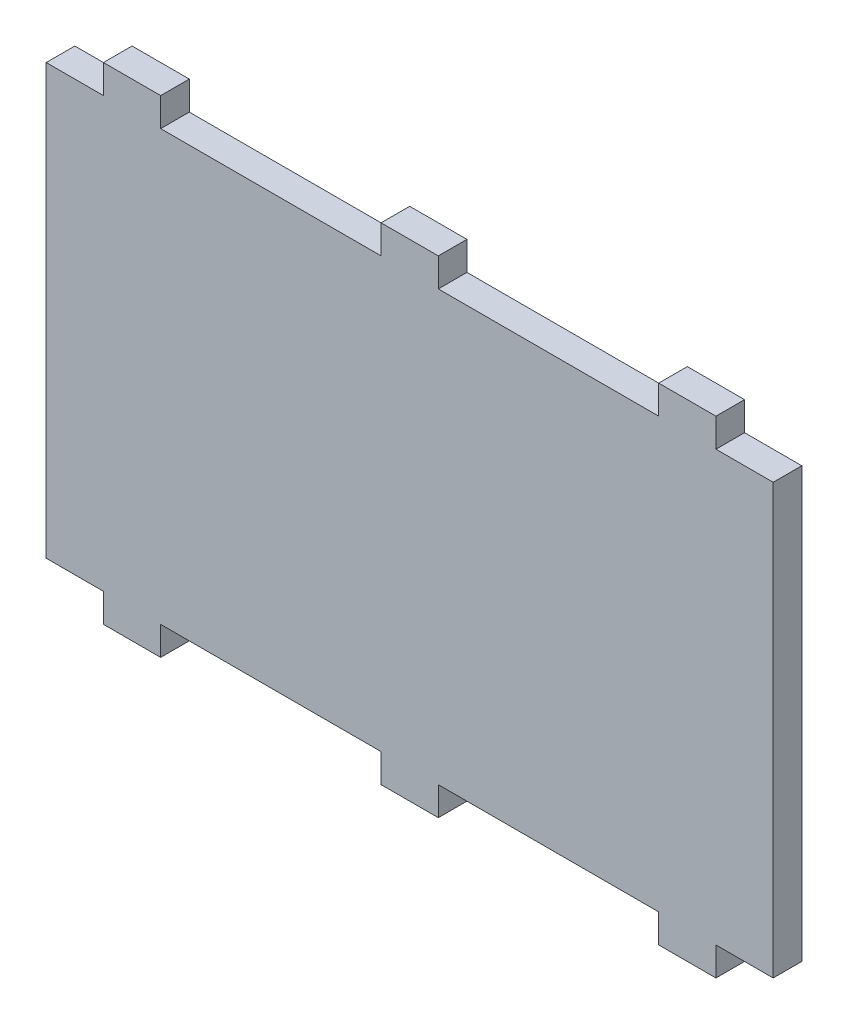
ISO-10303-21;
HEADER;
FILE_DESCRIPTION(('STEP AP214'),'2;1');
FILE_NAME('part.step','',(''),(''),'','','');
FILE_SCHEMA(('AUTOMOTIVE_DESIGN { 1 0 10303 214 1 1 1 1 }'));
ENDSEC;
DATA;
#1=APPLICATION_CONTEXT('core data for automotive mechanical design processes');
#2=APPLICATION_PROTOCOL_DEFINITION('international standard','automotive_design',2000,#1);
#3=PRODUCT_CONTEXT('',#1,'mechanical');
#4=PRODUCT('Part','Part','',(#3));
#5=PRODUCT_RELATED_PRODUCT_CATEGORY('part','',(#4));
#6=PRODUCT_DEFINITION_FORMATION('','',#4);
#7=PRODUCT_DEFINITION_CONTEXT('part definition',#1,'design');
#8=PRODUCT_DEFINITION('design','',#6,#7);
#9=PRODUCT_DEFINITION_SHAPE('','',#8);
#10=(LENGTH_UNIT() NAMED_UNIT(*) SI_UNIT(.MILLI.,.METRE.));
#11=(NAMED_UNIT(*) PLANE_ANGLE_UNIT() SI_UNIT($,.RADIAN.));
#12=(NAMED_UNIT(*) SI_UNIT($,.STERADIAN.) SOLID_ANGLE_UNIT());
#13=UNCERTAINTY_MEASURE_WITH_UNIT(LENGTH_MEASURE(1.E-05),#10,'distance_accuracy_value','');
#14=(GEOMETRIC_REPRESENTATION_CONTEXT(3) GLOBAL_UNCERTAINTY_ASSIGNED_CONTEXT((#13)) GLOBAL_UNIT_ASSIGNED_CONTEXT((#10,
#11,#12)) REPRESENTATION_CONTEXT('',''));
#15=CARTESIAN_POINT('',(0.,0.,0.));
#16=DIRECTION('',(0.,0.,1.));
#17=DIRECTION('',(1.,0.,0.));
#18=AXIS2_PLACEMENT_3D('',#15,#16,#17);
#19=CARTESIAN_POINT('',(0.,0.,5.));
#20=DIRECTION('',(0.,1.,0.));
#21=DIRECTION('',(0.,0.,1.));
#22=AXIS2_PLACEMENT_3D('',#19,#20,#21);
#23=PLANE('',#22);
#24=DIRECTION('',(1.,0.,0.));
#25=VECTOR('',#24,1.);
#26=CARTESIAN_POINT('',(0.,0.,0.));
#27=LINE('',#26,#25);
#28=CARTESIAN_POINT('',(68.5,0.,0.));
#29=VERTEX_POINT('',#28);
#30=CARTESIAN_POINT('',(107.,0.,0.));
#31=VERTEX_POINT('',#30);
#32=EDGE_CURVE('E320',#29,#31,#27,.T.);
#33=ORIENTED_EDGE('',*,*,#32,.T.);
#34=DIRECTION('',(0.,0.,1.));
#35=VECTOR('',#34,1.);
#36=CARTESIAN_POINT('',(107.,0.,0.));
#37=LINE('',#36,#35);
#38=CARTESIAN_POINT('',(107.,0.,5.));
#39=VERTEX_POINT('',#38);
#40=EDGE_CURVE('E58',#31,#39,#37,.T.);
#41=ORIENTED_EDGE('',*,*,#40,.T.);
#42=DIRECTION('',(1.,0.,0.));
#43=VECTOR('',#42,1.);
#44=CARTESIAN_POINT('',(0.,0.,5.));
#45=LINE('',#44,#43);
#46=CARTESIAN_POINT('',(68.5,0.,5.));
#47=VERTEX_POINT('',#46);
#48=EDGE_CURVE('E325',#47,#39,#45,.T.);
#49=ORIENTED_EDGE('',*,*,#48,.F.);
#50=DIRECTION('',(0.,0.,1.));
#51=VECTOR('',#50,1.);
#52=CARTESIAN_POINT('',(68.5,0.,0.));
#53=LINE('',#52,#51);
#54=EDGE_CURVE('E278',#29,#47,#53,.T.);
#55=ORIENTED_EDGE('',*,*,#54,.F.);
#56=EDGE_LOOP('',(#33,#41,#49,#55));
#57=FACE_BOUND('',#56,.T.);
#58=ADVANCED_FACE('F33',(#57),#23,.F.);
#59=CARTESIAN_POINT('',(20.,0.,0.));
#60=VERTEX_POINT('',#59);
#61=CARTESIAN_POINT('',(58.5,0.,0.));
#62=VERTEX_POINT('',#61);
#63=EDGE_CURVE('E323',#60,#62,#27,.T.);
#64=ORIENTED_EDGE('',*,*,#63,.T.);
#65=DIRECTION('',(0.,0.,1.));
#66=VECTOR('',#65,1.);
#67=CARTESIAN_POINT('',(58.5,0.,0.));
#68=LINE('',#67,#66);
#69=CARTESIAN_POINT('',(58.5,0.,5.));
#70=VERTEX_POINT('',#69);
#71=EDGE_CURVE('E275',#62,#70,#68,.T.);
#72=ORIENTED_EDGE('',*,*,#71,.T.);
#73=CARTESIAN_POINT('',(20.,0.,5.));
#74=VERTEX_POINT('',#73);
#75=EDGE_CURVE('E737',#74,#70,#45,.T.);
#76=ORIENTED_EDGE('',*,*,#75,.F.);
#77=DIRECTION('',(0.,0.,1.));
#78=VECTOR('',#77,1.);
#79=CARTESIAN_POINT('',(20.,0.,0.));
#80=LINE('',#79,#78);
#81=EDGE_CURVE('E303',#60,#74,#80,.T.);
#82=ORIENTED_EDGE('',*,*,#81,.F.);
#83=EDGE_LOOP('',(#64,#72,#76,#82));
#84=FACE_BOUND('',#83,.T.);
#85=ADVANCED_FACE('F496',(#84),#23,.F.);
#86=CARTESIAN_POINT('',(117.,0.,5.));
#87=VERTEX_POINT('',#86);
#88=CARTESIAN_POINT('',(127.,0.,5.));
#89=VERTEX_POINT('',#88);
#90=EDGE_CURVE('E37',#87,#89,#45,.T.);
#91=ORIENTED_EDGE('',*,*,#90,.F.);
#92=DIRECTION('',(0.,0.,1.));
#93=VECTOR('',#92,1.);
#94=CARTESIAN_POINT('',(117.,0.,0.));
#95=LINE('',#94,#93);
#96=CARTESIAN_POINT('',(117.,0.,0.));
#97=VERTEX_POINT('',#96);
#98=EDGE_CURVE('E254',#97,#87,#95,.T.);
#99=ORIENTED_EDGE('',*,*,#98,.F.);
#100=CARTESIAN_POINT('',(127.,0.,0.));
#101=VERTEX_POINT('',#100);
#102=EDGE_CURVE('E324',#97,#101,#27,.T.);
#103=ORIENTED_EDGE('',*,*,#102,.T.);
#104=DIRECTION('',(0.,0.,-1.));
#105=VECTOR('',#104,1.);
#106=CARTESIAN_POINT('',(127.,0.,5.));
#107=LINE('',#106,#105);
#108=EDGE_CURVE('E43',#89,#101,#107,.T.);
#109=ORIENTED_EDGE('',*,*,#108,.F.);
#110=EDGE_LOOP('',(#91,#99,#103,#109));
#111=FACE_BOUND('',#110,.T.);
#112=ADVANCED_FACE('F491',(#111),#23,.F.);
#113=CARTESIAN_POINT('',(0.,75.,5.));
#114=DIRECTION('',(0.,-1.,0.));
#115=DIRECTION('',(0.,0.,-1.));
#116=AXIS2_PLACEMENT_3D('',#113,#114,#115);
#117=PLANE('',#116);
#118=DIRECTION('',(-1.,0.,0.));
#119=VECTOR('',#118,1.);
#120=CARTESIAN_POINT('',(0.,75.,5.));
#121=LINE('',#120,#119);
#122=CARTESIAN_POINT('',(58.5,75.,5.));
#123=VERTEX_POINT('',#122);
#124=CARTESIAN_POINT('',(20.,75.,5.));
#125=VERTEX_POINT('',#124);
#126=EDGE_CURVE('E342',#123,#125,#121,.T.);
#127=ORIENTED_EDGE('',*,*,#126,.F.);
#128=DIRECTION('',(0.,0.,1.));
#129=VECTOR('',#128,1.);
#130=CARTESIAN_POINT('',(58.5,75.,0.));
#131=LINE('',#130,#129);
#132=CARTESIAN_POINT('',(58.5,75.,0.));
#133=VERTEX_POINT('',#132);
#134=EDGE_CURVE('E766',#133,#123,#131,.T.);
#135=ORIENTED_EDGE('',*,*,#134,.F.);
#136=DIRECTION('',(-1.,0.,0.));
#137=VECTOR('',#136,1.);
#138=CARTESIAN_POINT('',(0.,75.,0.));
#139=LINE('',#138,#137);
#140=CARTESIAN_POINT('',(20.,75.,0.));
#141=VERTEX_POINT('',#140);
#142=EDGE_CURVE('E346',#133,#141,#139,.T.);
#143=ORIENTED_EDGE('',*,*,#142,.T.);
#144=DIRECTION('',(0.,0.,1.));
#145=VECTOR('',#144,1.);
#146=CARTESIAN_POINT('',(20.,75.,0.));
#147=LINE('',#146,#145);
#148=EDGE_CURVE('E442',#141,#125,#147,.T.);
#149=ORIENTED_EDGE('',*,*,#148,.T.);
#150=EDGE_LOOP('',(#127,#135,#143,#149));
#151=FACE_BOUND('',#150,.T.);
#152=ADVANCED_FACE('F484',(#151),#117,.F.);
#153=CARTESIAN_POINT('',(127.,75.,0.));
#154=VERTEX_POINT('',#153);
#155=CARTESIAN_POINT('',(117.,75.,0.));
#156=VERTEX_POINT('',#155);
#157=EDGE_CURVE('E363',#154,#156,#139,.T.);
#158=ORIENTED_EDGE('',*,*,#157,.T.);
#159=DIRECTION('',(0.,0.,1.));
#160=VECTOR('',#159,1.);
#161=CARTESIAN_POINT('',(117.,75.,0.));
#162=LINE('',#161,#160);
#163=CARTESIAN_POINT('',(117.,75.,5.));
#164=VERTEX_POINT('',#163);
#165=EDGE_CURVE('E402',#156,#164,#162,.T.);
#166=ORIENTED_EDGE('',*,*,#165,.T.);
#167=CARTESIAN_POINT('',(127.,75.,5.));
#168=VERTEX_POINT('',#167);
#169=EDGE_CURVE('E357',#168,#164,#121,.T.);
#170=ORIENTED_EDGE('',*,*,#169,.F.);
#171=DIRECTION('',(0.,0.,-1.));
#172=VECTOR('',#171,1.);
#173=CARTESIAN_POINT('',(127.,75.,5.));
#174=LINE('',#173,#172);
#175=EDGE_CURVE('E378',#168,#154,#174,.T.);
#176=ORIENTED_EDGE('',*,*,#175,.T.);
#177=EDGE_LOOP('',(#158,#166,#170,#176));
#178=FACE_BOUND('',#177,.T.);
#179=ADVANCED_FACE('F482',(#178),#117,.F.);
#180=DIRECTION('',(0.,0.,1.));
#181=VECTOR('',#180,1.);
#182=CARTESIAN_POINT('',(9.99999999999999,75.,0.));
#183=LINE('',#182,#181);
#184=CARTESIAN_POINT('',(9.99999999999999,75.,0.));
#185=VERTEX_POINT('',#184);
#186=CARTESIAN_POINT('',(9.99999999999999,75.,5.));
#187=VERTEX_POINT('',#186);
#188=EDGE_CURVE('E431',#185,#187,#183,.T.);
#189=ORIENTED_EDGE('',*,*,#188,.F.);
#190=CARTESIAN_POINT('',(0.,75.,0.));
#191=VERTEX_POINT('',#190);
#192=EDGE_CURVE('E372',#185,#191,#139,.T.);
#193=ORIENTED_EDGE('',*,*,#192,.T.);
#194=DIRECTION('',(0.,0.,-1.));
#195=VECTOR('',#194,1.);
#196=CARTESIAN_POINT('',(0.,75.,5.));
#197=LINE('',#196,#195);
#198=CARTESIAN_POINT('',(0.,75.,5.));
#199=VERTEX_POINT('',#198);
#200=EDGE_CURVE('E368',#199,#191,#197,.T.);
#201=ORIENTED_EDGE('',*,*,#200,.F.);
#202=EDGE_CURVE('E345',#187,#199,#121,.T.);
#203=ORIENTED_EDGE('',*,*,#202,.F.);
#204=EDGE_LOOP('',(#189,#193,#201,#203));
#205=FACE_BOUND('',#204,.T.);
#206=ADVANCED_FACE('F477',(#205),#117,.F.);
#207=CARTESIAN_POINT('',(0.,0.,5.));
#208=DIRECTION('',(1.,0.,0.));
#209=DIRECTION('',(0.,0.,-1.));
#210=AXIS2_PLACEMENT_3D('',#207,#208,#209);
#211=PLANE('',#210);
#212=DIRECTION('',(0.,-1.,0.));
#213=VECTOR('',#212,1.);
#214=CARTESIAN_POINT('',(0.,0.,0.));
#215=LINE('',#214,#213);
#216=CARTESIAN_POINT('',(0.,0.,0.));
#217=VERTEX_POINT('',#216);
#218=EDGE_CURVE('E329',#191,#217,#215,.T.);
#219=ORIENTED_EDGE('',*,*,#218,.T.);
#220=DIRECTION('',(0.,0.,-1.));
#221=VECTOR('',#220,1.);
#222=CARTESIAN_POINT('',(0.,0.,5.));
#223=LINE('',#222,#221);
#224=CARTESIAN_POINT('',(0.,0.,5.));
#225=VERTEX_POINT('',#224);
#226=EDGE_CURVE('E11',#225,#217,#223,.T.);
#227=ORIENTED_EDGE('',*,*,#226,.F.);
#228=DIRECTION('',(0.,-1.,0.));
#229=VECTOR('',#228,1.);
#230=CARTESIAN_POINT('',(0.,0.,5.));
#231=LINE('',#230,#229);
#232=EDGE_CURVE('E375',#199,#225,#231,.T.);
#233=ORIENTED_EDGE('',*,*,#232,.F.);
#234=ORIENTED_EDGE('',*,*,#200,.T.);
#235=EDGE_LOOP('',(#219,#227,#233,#234));
#236=FACE_BOUND('',#235,.T.);
#237=ADVANCED_FACE('F35',(#236),#211,.F.);
#238=CARTESIAN_POINT('',(10.,0.,0.));
#239=VERTEX_POINT('',#238);
#240=EDGE_CURVE('E339',#217,#239,#27,.T.);
#241=ORIENTED_EDGE('',*,*,#240,.T.);
#242=DIRECTION('',(0.,0.,1.));
#243=VECTOR('',#242,1.);
#244=CARTESIAN_POINT('',(10.,0.,0.));
#245=LINE('',#244,#243);
#246=CARTESIAN_POINT('',(10.,0.,5.));
#247=VERTEX_POINT('',#246);
#248=EDGE_CURVE('E298',#239,#247,#245,.T.);
#249=ORIENTED_EDGE('',*,*,#248,.T.);
#250=EDGE_CURVE('E739',#225,#247,#45,.T.);
#251=ORIENTED_EDGE('',*,*,#250,.F.);
#252=ORIENTED_EDGE('',*,*,#226,.T.);
#253=EDGE_LOOP('',(#241,#249,#251,#252));
#254=FACE_BOUND('',#253,.T.);
#255=ADVANCED_FACE('F497',(#254),#23,.F.);
#256=CARTESIAN_POINT('',(127.,0.,5.));
#257=DIRECTION('',(-1.,0.,0.));
#258=DIRECTION('',(0.,0.,1.));
#259=AXIS2_PLACEMENT_3D('',#256,#257,#258);
#260=PLANE('',#259);
#261=DIRECTION('',(0.,1.,0.));
#262=VECTOR('',#261,1.);
#263=CARTESIAN_POINT('',(127.,0.,0.));
#264=LINE('',#263,#262);
#265=EDGE_CURVE('E331',#101,#154,#264,.T.);
#266=ORIENTED_EDGE('',*,*,#265,.T.);
#267=ORIENTED_EDGE('',*,*,#175,.F.);
#268=DIRECTION('',(0.,1.,0.));
#269=VECTOR('',#268,1.);
#270=CARTESIAN_POINT('',(127.,0.,5.));
#271=LINE('',#270,#269);
#272=EDGE_CURVE('E350',#89,#168,#271,.T.);
#273=ORIENTED_EDGE('',*,*,#272,.F.);
#274=ORIENTED_EDGE('',*,*,#108,.T.);
#275=EDGE_LOOP('',(#266,#267,#273,#274));
#276=FACE_BOUND('',#275,.T.);
#277=ADVANCED_FACE('F480',(#276),#260,.F.);
#278=CARTESIAN_POINT('',(107.,75.,0.));
#279=VERTEX_POINT('',#278);
#280=CARTESIAN_POINT('',(68.5,75.,0.));
#281=VERTEX_POINT('',#280);
#282=EDGE_CURVE('E361',#279,#281,#139,.T.);
#283=ORIENTED_EDGE('',*,*,#282,.T.);
#284=DIRECTION('',(0.,0.,1.));
#285=VECTOR('',#284,1.);
#286=CARTESIAN_POINT('',(68.5,75.,0.));
#287=LINE('',#286,#285);
#288=CARTESIAN_POINT('',(68.5,75.,5.));
#289=VERTEX_POINT('',#288);
#290=EDGE_CURVE('E774',#281,#289,#287,.T.);
#291=ORIENTED_EDGE('',*,*,#290,.T.);
#292=CARTESIAN_POINT('',(107.,75.,5.));
#293=VERTEX_POINT('',#292);
#294=EDGE_CURVE('E344',#293,#289,#121,.T.);
#295=ORIENTED_EDGE('',*,*,#294,.F.);
#296=DIRECTION('',(0.,0.,1.));
#297=VECTOR('',#296,1.);
#298=CARTESIAN_POINT('',(107.,75.,0.));
#299=LINE('',#298,#297);
#300=EDGE_CURVE('E422',#279,#293,#299,.T.);
#301=ORIENTED_EDGE('',*,*,#300,.F.);
#302=EDGE_LOOP('',(#283,#291,#295,#301));
#303=FACE_BOUND('',#302,.T.);
#304=ADVANCED_FACE('F490',(#303),#117,.F.);
#305=CARTESIAN_POINT('',(0.,0.,5.));
#306=DIRECTION('',(0.,0.,-1.));
#307=DIRECTION('',(-1.,0.,0.));
#308=AXIS2_PLACEMENT_3D('',#305,#306,#307);
#309=PLANE('',#308);
#310=ORIENTED_EDGE('',*,*,#232,.T.);
#311=ORIENTED_EDGE('',*,*,#250,.T.);
#312=DIRECTION('',(0.,-1.,0.));
#313=VECTOR('',#312,1.);
#314=CARTESIAN_POINT('',(10.,0.,5.));
#315=LINE('',#314,#313);
#316=CARTESIAN_POINT('',(10.,-5.,5.));
#317=VERTEX_POINT('',#316);
#318=EDGE_CURVE('E277',#247,#317,#315,.T.);
#319=ORIENTED_EDGE('',*,*,#318,.T.);
#320=DIRECTION('',(1.,0.,0.));
#321=VECTOR('',#320,1.);
#322=CARTESIAN_POINT('',(10.,-5.,5.));
#323=LINE('',#322,#321);
#324=CARTESIAN_POINT('',(20.,-5.,5.));
#325=VERTEX_POINT('',#324);
#326=EDGE_CURVE('E289',#317,#325,#323,.T.);
#327=ORIENTED_EDGE('',*,*,#326,.T.);
#328=DIRECTION('',(0.,1.,0.));
#329=VECTOR('',#328,1.);
#330=CARTESIAN_POINT('',(20.,0.,5.));
#331=LINE('',#330,#329);
#332=EDGE_CURVE('E292',#325,#74,#331,.T.);
#333=ORIENTED_EDGE('',*,*,#332,.T.);
#334=ORIENTED_EDGE('',*,*,#75,.T.);
#335=DIRECTION('',(0.,-1.,0.));
#336=VECTOR('',#335,1.);
#337=CARTESIAN_POINT('',(58.5,0.,5.));
#338=LINE('',#337,#336);
#339=CARTESIAN_POINT('',(58.5,-5.,5.));
#340=VERTEX_POINT('',#339);
#341=EDGE_CURVE('E253',#70,#340,#338,.T.);
#342=ORIENTED_EDGE('',*,*,#341,.T.);
#343=DIRECTION('',(1.,0.,0.));
#344=VECTOR('',#343,1.);
#345=CARTESIAN_POINT('',(58.5,-5.,5.));
#346=LINE('',#345,#344);
#347=CARTESIAN_POINT('',(68.5,-5.,5.));
#348=VERTEX_POINT('',#347);
#349=EDGE_CURVE('E270',#340,#348,#346,.T.);
#350=ORIENTED_EDGE('',*,*,#349,.T.);
#351=DIRECTION('',(0.,1.,0.));
#352=VECTOR('',#351,1.);
#353=CARTESIAN_POINT('',(68.5,0.,5.));
#354=LINE('',#353,#352);
#355=EDGE_CURVE('E261',#348,#47,#354,.T.);
#356=ORIENTED_EDGE('',*,*,#355,.T.);
#357=ORIENTED_EDGE('',*,*,#48,.T.);
#358=DIRECTION('',(0.,-1.,0.));
#359=VECTOR('',#358,1.);
#360=CARTESIAN_POINT('',(107.,0.,5.));
#361=LINE('',#360,#359);
#362=CARTESIAN_POINT('',(107.,-5.,5.));
#363=VERTEX_POINT('',#362);
#364=EDGE_CURVE('E249',#39,#363,#361,.T.);
#365=ORIENTED_EDGE('',*,*,#364,.T.);
#366=DIRECTION('',(1.,0.,0.));
#367=VECTOR('',#366,1.);
#368=CARTESIAN_POINT('',(107.,-5.,5.));
#369=LINE('',#368,#367);
#370=CARTESIAN_POINT('',(117.,-5.,5.));
#371=VERTEX_POINT('',#370);
#372=EDGE_CURVE('E226',#363,#371,#369,.T.);
#373=ORIENTED_EDGE('',*,*,#372,.T.);
#374=DIRECTION('',(0.,1.,0.));
#375=VECTOR('',#374,1.);
#376=CARTESIAN_POINT('',(117.,0.,5.));
#377=LINE('',#376,#375);
#378=EDGE_CURVE('E243',#371,#87,#377,.T.);
#379=ORIENTED_EDGE('',*,*,#378,.T.);
#380=ORIENTED_EDGE('',*,*,#90,.T.);
#381=ORIENTED_EDGE('',*,*,#272,.T.);
#382=ORIENTED_EDGE('',*,*,#169,.T.);
#383=DIRECTION('',(0.,1.,0.));
#384=VECTOR('',#383,1.);
#385=CARTESIAN_POINT('',(117.,75.,5.));
#386=LINE('',#385,#384);
#387=CARTESIAN_POINT('',(117.,80.,5.));
#388=VERTEX_POINT('',#387);
#389=EDGE_CURVE('E396',#164,#388,#386,.T.);
#390=ORIENTED_EDGE('',*,*,#389,.T.);
#391=DIRECTION('',(-1.,0.,0.));
#392=VECTOR('',#391,1.);
#393=CARTESIAN_POINT('',(117.,80.,5.));
#394=LINE('',#393,#392);
#395=CARTESIAN_POINT('',(107.,80.,5.));
#396=VERTEX_POINT('',#395);
#397=EDGE_CURVE('E406',#388,#396,#394,.T.);
#398=ORIENTED_EDGE('',*,*,#397,.T.);
#399=DIRECTION('',(0.,-1.,0.));
#400=VECTOR('',#399,1.);
#401=CARTESIAN_POINT('',(107.,75.,5.));
#402=LINE('',#401,#400);
#403=EDGE_CURVE('E409',#396,#293,#402,.T.);
#404=ORIENTED_EDGE('',*,*,#403,.T.);
#405=ORIENTED_EDGE('',*,*,#294,.T.);
#406=DIRECTION('',(0.,1.,0.));
#407=VECTOR('',#406,1.);
#408=CARTESIAN_POINT('',(68.5,75.,5.));
#409=LINE('',#408,#407);
#410=CARTESIAN_POINT('',(68.5,80.,5.));
#411=VERTEX_POINT('',#410);
#412=EDGE_CURVE('E768',#289,#411,#409,.T.);
#413=ORIENTED_EDGE('',*,*,#412,.T.);
#414=DIRECTION('',(-1.,0.,0.));
#415=VECTOR('',#414,1.);
#416=CARTESIAN_POINT('',(58.5,80.,5.));
#417=LINE('',#416,#415);
#418=CARTESIAN_POINT('',(58.5,80.,5.));
#419=VERTEX_POINT('',#418);
#420=EDGE_CURVE('E760',#411,#419,#417,.T.);
#421=ORIENTED_EDGE('',*,*,#420,.T.);
#422=DIRECTION('',(0.,-1.,0.));
#423=VECTOR('',#422,1.);
#424=CARTESIAN_POINT('',(58.5,75.,5.));
#425=LINE('',#424,#423);
#426=EDGE_CURVE('E302',#419,#123,#425,.T.);
#427=ORIENTED_EDGE('',*,*,#426,.T.);
#428=ORIENTED_EDGE('',*,*,#126,.T.);
#429=DIRECTION('',(0.,1.,0.));
#430=VECTOR('',#429,1.);
#431=CARTESIAN_POINT('',(20.,75.,5.));
#432=LINE('',#431,#430);
#433=CARTESIAN_POINT('',(20.,80.,5.));
#434=VERTEX_POINT('',#433);
#435=EDGE_CURVE('E437',#125,#434,#432,.T.);
#436=ORIENTED_EDGE('',*,*,#435,.T.);
#437=DIRECTION('',(-1.,0.,0.));
#438=VECTOR('',#437,1.);
#439=CARTESIAN_POINT('',(10.,80.,5.));
#440=LINE('',#439,#438);
#441=CARTESIAN_POINT('',(10.,80.,5.));
#442=VERTEX_POINT('',#441);
#443=EDGE_CURVE('E433',#434,#442,#440,.T.);
#444=ORIENTED_EDGE('',*,*,#443,.T.);
#445=DIRECTION('',(0.,-1.,0.));
#446=VECTOR('',#445,1.);
#447=CARTESIAN_POINT('',(9.99999999999999,75.,5.));
#448=LINE('',#447,#446);
#449=EDGE_CURVE('E421',#442,#187,#448,.T.);
#450=ORIENTED_EDGE('',*,*,#449,.T.);
#451=ORIENTED_EDGE('',*,*,#202,.T.);
#452=EDGE_LOOP('',(#310,#311,#319,#327,#333,#334,#342,#350,#356,#357,#365,#373,#379,#380,#381,
#382,#390,#398,#404,#405,#413,#421,#427,#428,#436,#444,#450,#451));
#453=FACE_BOUND('',#452,.T.);
#454=ADVANCED_FACE('F394',(#453),#309,.F.);
#455=CARTESIAN_POINT('',(0.,0.,0.));
#456=DIRECTION('',(0.,0.,-1.));
#457=DIRECTION('',(-1.,0.,0.));
#458=AXIS2_PLACEMENT_3D('',#455,#456,#457);
#459=PLANE('',#458);
#460=ORIENTED_EDGE('',*,*,#218,.F.);
#461=ORIENTED_EDGE('',*,*,#192,.F.);
#462=DIRECTION('',(0.,-1.,0.));
#463=VECTOR('',#462,1.);
#464=CARTESIAN_POINT('',(9.99999999999999,75.,0.));
#465=LINE('',#464,#463);
#466=CARTESIAN_POINT('',(10.,80.,0.));
#467=VERTEX_POINT('',#466);
#468=EDGE_CURVE('E436',#467,#185,#465,.T.);
#469=ORIENTED_EDGE('',*,*,#468,.F.);
#470=DIRECTION('',(-1.,0.,0.));
#471=VECTOR('',#470,1.);
#472=CARTESIAN_POINT('',(10.,80.,0.));
#473=LINE('',#472,#471);
#474=CARTESIAN_POINT('',(20.,80.,0.));
#475=VERTEX_POINT('',#474);
#476=EDGE_CURVE('E428',#475,#467,#473,.T.);
#477=ORIENTED_EDGE('',*,*,#476,.F.);
#478=DIRECTION('',(0.,1.,0.));
#479=VECTOR('',#478,1.);
#480=CARTESIAN_POINT('',(20.,75.,0.));
#481=LINE('',#480,#479);
#482=EDGE_CURVE('E432',#141,#475,#481,.T.);
#483=ORIENTED_EDGE('',*,*,#482,.F.);
#484=ORIENTED_EDGE('',*,*,#142,.F.);
#485=DIRECTION('',(0.,-1.,0.));
#486=VECTOR('',#485,1.);
#487=CARTESIAN_POINT('',(58.5,75.,0.));
#488=LINE('',#487,#486);
#489=CARTESIAN_POINT('',(58.5,80.,0.));
#490=VERTEX_POINT('',#489);
#491=EDGE_CURVE('E756',#490,#133,#488,.T.);
#492=ORIENTED_EDGE('',*,*,#491,.F.);
#493=DIRECTION('',(-1.,0.,0.));
#494=VECTOR('',#493,1.);
#495=CARTESIAN_POINT('',(58.5,80.,0.));
#496=LINE('',#495,#494);
#497=CARTESIAN_POINT('',(68.5,80.,0.));
#498=VERTEX_POINT('',#497);
#499=EDGE_CURVE('E763',#498,#490,#496,.T.);
#500=ORIENTED_EDGE('',*,*,#499,.F.);
#501=DIRECTION('',(0.,1.,0.));
#502=VECTOR('',#501,1.);
#503=CARTESIAN_POINT('',(68.5,75.,0.));
#504=LINE('',#503,#502);
#505=EDGE_CURVE('E759',#281,#498,#504,.T.);
#506=ORIENTED_EDGE('',*,*,#505,.F.);
#507=ORIENTED_EDGE('',*,*,#282,.F.);
#508=DIRECTION('',(0.,-1.,0.));
#509=VECTOR('',#508,1.);
#510=CARTESIAN_POINT('',(107.,75.,0.));
#511=LINE('',#510,#509);
#512=CARTESIAN_POINT('',(107.,80.,0.));
#513=VERTEX_POINT('',#512);
#514=EDGE_CURVE('E414',#513,#279,#511,.T.);
#515=ORIENTED_EDGE('',*,*,#514,.F.);
#516=DIRECTION('',(-1.,0.,0.));
#517=VECTOR('',#516,1.);
#518=CARTESIAN_POINT('',(117.,80.,0.));
#519=LINE('',#518,#517);
#520=CARTESIAN_POINT('',(117.,80.,0.));
#521=VERTEX_POINT('',#520);
#522=EDGE_CURVE('E778',#521,#513,#519,.T.);
#523=ORIENTED_EDGE('',*,*,#522,.F.);
#524=DIRECTION('',(0.,1.,0.));
#525=VECTOR('',#524,1.);
#526=CARTESIAN_POINT('',(117.,75.,0.));
#527=LINE('',#526,#525);
#528=EDGE_CURVE('E419',#156,#521,#527,.T.);
#529=ORIENTED_EDGE('',*,*,#528,.F.);
#530=ORIENTED_EDGE('',*,*,#157,.F.);
#531=ORIENTED_EDGE('',*,*,#265,.F.);
#532=ORIENTED_EDGE('',*,*,#102,.F.);
#533=DIRECTION('',(0.,1.,0.));
#534=VECTOR('',#533,1.);
#535=CARTESIAN_POINT('',(117.,0.,0.));
#536=LINE('',#535,#534);
#537=CARTESIAN_POINT('',(117.,-5.,0.));
#538=VERTEX_POINT('',#537);
#539=EDGE_CURVE('E232',#538,#97,#536,.T.);
#540=ORIENTED_EDGE('',*,*,#539,.F.);
#541=DIRECTION('',(1.,0.,0.));
#542=VECTOR('',#541,1.);
#543=CARTESIAN_POINT('',(107.,-5.,0.));
#544=LINE('',#543,#542);
#545=CARTESIAN_POINT('',(107.,-5.,0.));
#546=VERTEX_POINT('',#545);
#547=EDGE_CURVE('E224',#546,#538,#544,.T.);
#548=ORIENTED_EDGE('',*,*,#547,.F.);
#549=DIRECTION('',(0.,-1.,0.));
#550=VECTOR('',#549,1.);
#551=CARTESIAN_POINT('',(107.,0.,0.));
#552=LINE('',#551,#550);
#553=EDGE_CURVE('E239',#31,#546,#552,.T.);
#554=ORIENTED_EDGE('',*,*,#553,.F.);
#555=ORIENTED_EDGE('',*,*,#32,.F.);
#556=DIRECTION('',(0.,1.,0.));
#557=VECTOR('',#556,1.);
#558=CARTESIAN_POINT('',(68.5,0.,0.));
#559=LINE('',#558,#557);
#560=CARTESIAN_POINT('',(68.5,-5.,0.));
#561=VERTEX_POINT('',#560);
#562=EDGE_CURVE('E264',#561,#29,#559,.T.);
#563=ORIENTED_EDGE('',*,*,#562,.F.);
#564=DIRECTION('',(1.,0.,0.));
#565=VECTOR('',#564,1.);
#566=CARTESIAN_POINT('',(58.5,-5.,0.));
#567=LINE('',#566,#565);
#568=CARTESIAN_POINT('',(58.5,-5.,0.));
#569=VERTEX_POINT('',#568);
#570=EDGE_CURVE('E260',#569,#561,#567,.T.);
#571=ORIENTED_EDGE('',*,*,#570,.F.);
#572=DIRECTION('',(0.,-1.,0.));
#573=VECTOR('',#572,1.);
#574=CARTESIAN_POINT('',(58.5,0.,0.));
#575=LINE('',#574,#573);
#576=EDGE_CURVE('E257',#62,#569,#575,.T.);
#577=ORIENTED_EDGE('',*,*,#576,.F.);
#578=ORIENTED_EDGE('',*,*,#63,.F.);
#579=DIRECTION('',(0.,1.,0.));
#580=VECTOR('',#579,1.);
#581=CARTESIAN_POINT('',(20.,0.,0.));
#582=LINE('',#581,#580);
#583=CARTESIAN_POINT('',(20.,-5.,0.));
#584=VERTEX_POINT('',#583);
#585=EDGE_CURVE('E287',#584,#60,#582,.T.);
#586=ORIENTED_EDGE('',*,*,#585,.F.);
#587=DIRECTION('',(1.,0.,0.));
#588=VECTOR('',#587,1.);
#589=CARTESIAN_POINT('',(10.,-5.,0.));
#590=LINE('',#589,#588);
#591=CARTESIAN_POINT('',(10.,-5.,0.));
#592=VERTEX_POINT('',#591);
#593=EDGE_CURVE('E284',#592,#584,#590,.T.);
#594=ORIENTED_EDGE('',*,*,#593,.F.);
#595=DIRECTION('',(0.,-1.,0.));
#596=VECTOR('',#595,1.);
#597=CARTESIAN_POINT('',(10.,0.,0.));
#598=LINE('',#597,#596);
#599=EDGE_CURVE('E288',#239,#592,#598,.T.);
#600=ORIENTED_EDGE('',*,*,#599,.F.);
#601=ORIENTED_EDGE('',*,*,#240,.F.);
#602=EDGE_LOOP('',(#460,#461,#469,#477,#483,#484,#492,#500,#506,#507,#515,#523,#529,#530,#531,
#532,#540,#548,#554,#555,#563,#571,#577,#578,#586,#594,#600,#601));
#603=FACE_BOUND('',#602,.T.);
#604=ADVANCED_FACE('F238',(#603),#459,.T.);
#605=CARTESIAN_POINT('',(9.99999999999999,75.,0.));
#606=DIRECTION('',(-1.,0.,0.));
#607=DIRECTION('',(0.,-1.,0.));
#608=AXIS2_PLACEMENT_3D('',#605,#606,#607);
#609=PLANE('',#608);
#610=ORIENTED_EDGE('',*,*,#449,.F.);
#611=DIRECTION('',(0.,0.,1.));
#612=VECTOR('',#611,1.);
#613=CARTESIAN_POINT('',(10.,80.,0.));
#614=LINE('',#613,#612);
#615=EDGE_CURVE('E438',#467,#442,#614,.T.);
#616=ORIENTED_EDGE('',*,*,#615,.F.);
#617=ORIENTED_EDGE('',*,*,#468,.T.);
#618=ORIENTED_EDGE('',*,*,#188,.T.);
#619=EDGE_LOOP('',(#610,#616,#617,#618));
#620=FACE_BOUND('',#619,.T.);
#621=ADVANCED_FACE('F473',(#620),#609,.T.);
#622=CARTESIAN_POINT('',(10.,80.,0.));
#623=DIRECTION('',(0.,1.,0.));
#624=DIRECTION('',(0.,0.,1.));
#625=AXIS2_PLACEMENT_3D('',#622,#623,#624);
#626=PLANE('',#625);
#627=ORIENTED_EDGE('',*,*,#443,.F.);
#628=DIRECTION('',(0.,0.,1.));
#629=VECTOR('',#628,1.);
#630=CARTESIAN_POINT('',(20.,80.,0.));
#631=LINE('',#630,#629);
#632=EDGE_CURVE('E440',#475,#434,#631,.T.);
#633=ORIENTED_EDGE('',*,*,#632,.F.);
#634=ORIENTED_EDGE('',*,*,#476,.T.);
#635=ORIENTED_EDGE('',*,*,#615,.T.);
#636=EDGE_LOOP('',(#627,#633,#634,#635));
#637=FACE_BOUND('',#636,.T.);
#638=ADVANCED_FACE('F469',(#637),#626,.T.);
#639=CARTESIAN_POINT('',(20.,75.,0.));
#640=DIRECTION('',(1.,0.,0.));
#641=DIRECTION('',(0.,0.,-1.));
#642=AXIS2_PLACEMENT_3D('',#639,#640,#641);
#643=PLANE('',#642);
#644=ORIENTED_EDGE('',*,*,#435,.F.);
#645=ORIENTED_EDGE('',*,*,#148,.F.);
#646=ORIENTED_EDGE('',*,*,#482,.T.);
#647=ORIENTED_EDGE('',*,*,#632,.T.);
#648=EDGE_LOOP('',(#644,#645,#646,#647));
#649=FACE_BOUND('',#648,.T.);
#650=ADVANCED_FACE('F578',(#649),#643,.T.);
#651=CARTESIAN_POINT('',(117.,75.,0.));
#652=DIRECTION('',(1.,0.,0.));
#653=DIRECTION('',(0.,0.,-1.));
#654=AXIS2_PLACEMENT_3D('',#651,#652,#653);
#655=PLANE('',#654);
#656=ORIENTED_EDGE('',*,*,#389,.F.);
#657=ORIENTED_EDGE('',*,*,#165,.F.);
#658=ORIENTED_EDGE('',*,*,#528,.T.);
#659=DIRECTION('',(0.,0.,1.));
#660=VECTOR('',#659,1.);
#661=CARTESIAN_POINT('',(117.,80.,0.));
#662=LINE('',#661,#660);
#663=EDGE_CURVE('E404',#521,#388,#662,.T.);
#664=ORIENTED_EDGE('',*,*,#663,.T.);
#665=EDGE_LOOP('',(#656,#657,#658,#664));
#666=FACE_BOUND('',#665,.T.);
#667=ADVANCED_FACE('F400',(#666),#655,.T.);
#668=CARTESIAN_POINT('',(107.,75.,0.));
#669=DIRECTION('',(-1.,0.,0.));
#670=DIRECTION('',(0.,0.,1.));
#671=AXIS2_PLACEMENT_3D('',#668,#669,#670);
#672=PLANE('',#671);
#673=ORIENTED_EDGE('',*,*,#403,.F.);
#674=DIRECTION('',(0.,0.,1.));
#675=VECTOR('',#674,1.);
#676=CARTESIAN_POINT('',(107.,80.,0.));
#677=LINE('',#676,#675);
#678=EDGE_CURVE('E425',#513,#396,#677,.T.);
#679=ORIENTED_EDGE('',*,*,#678,.F.);
#680=ORIENTED_EDGE('',*,*,#514,.T.);
#681=ORIENTED_EDGE('',*,*,#300,.T.);
#682=EDGE_LOOP('',(#673,#679,#680,#681));
#683=FACE_BOUND('',#682,.T.);
#684=ADVANCED_FACE('F595',(#683),#672,.T.);
#685=CARTESIAN_POINT('',(117.,80.,0.));
#686=DIRECTION('',(0.,1.,0.));
#687=DIRECTION('',(0.,0.,1.));
#688=AXIS2_PLACEMENT_3D('',#685,#686,#687);
#689=PLANE('',#688);
#690=ORIENTED_EDGE('',*,*,#397,.F.);
#691=ORIENTED_EDGE('',*,*,#663,.F.);
#692=ORIENTED_EDGE('',*,*,#522,.T.);
#693=ORIENTED_EDGE('',*,*,#678,.T.);
#694=EDGE_LOOP('',(#690,#691,#692,#693));
#695=FACE_BOUND('',#694,.T.);
#696=ADVANCED_FACE('F604',(#695),#689,.T.);
#697=CARTESIAN_POINT('',(58.5,75.,0.));
#698=DIRECTION('',(-1.,0.,0.));
#699=DIRECTION('',(0.,0.,1.));
#700=AXIS2_PLACEMENT_3D('',#697,#698,#699);
#701=PLANE('',#700);
#702=ORIENTED_EDGE('',*,*,#426,.F.);
#703=DIRECTION('',(0.,0.,1.));
#704=VECTOR('',#703,1.);
#705=CARTESIAN_POINT('',(58.5,80.,0.));
#706=LINE('',#705,#704);
#707=EDGE_CURVE('E407',#490,#419,#706,.T.);
#708=ORIENTED_EDGE('',*,*,#707,.F.);
#709=ORIENTED_EDGE('',*,*,#491,.T.);
#710=ORIENTED_EDGE('',*,*,#134,.T.);
#711=EDGE_LOOP('',(#702,#708,#709,#710));
#712=FACE_BOUND('',#711,.T.);
#713=ADVANCED_FACE('F614',(#712),#701,.T.);
#714=CARTESIAN_POINT('',(58.5,80.,0.));
#715=DIRECTION('',(0.,1.,0.));
#716=DIRECTION('',(0.,0.,1.));
#717=AXIS2_PLACEMENT_3D('',#714,#715,#716);
#718=PLANE('',#717);
#719=ORIENTED_EDGE('',*,*,#420,.F.);
#720=DIRECTION('',(0.,0.,1.));
#721=VECTOR('',#720,1.);
#722=CARTESIAN_POINT('',(68.5,80.,0.));
#723=LINE('',#722,#721);
#724=EDGE_CURVE('E411',#498,#411,#723,.T.);
#725=ORIENTED_EDGE('',*,*,#724,.F.);
#726=ORIENTED_EDGE('',*,*,#499,.T.);
#727=ORIENTED_EDGE('',*,*,#707,.T.);
#728=EDGE_LOOP('',(#719,#725,#726,#727));
#729=FACE_BOUND('',#728,.T.);
#730=ADVANCED_FACE('F624',(#729),#718,.T.);
#731=CARTESIAN_POINT('',(68.5,75.,0.));
#732=DIRECTION('',(1.,0.,0.));
#733=DIRECTION('',(0.,0.,-1.));
#734=AXIS2_PLACEMENT_3D('',#731,#732,#733);
#735=PLANE('',#734);
#736=ORIENTED_EDGE('',*,*,#412,.F.);
#737=ORIENTED_EDGE('',*,*,#290,.F.);
#738=ORIENTED_EDGE('',*,*,#505,.T.);
#739=ORIENTED_EDGE('',*,*,#724,.T.);
#740=EDGE_LOOP('',(#736,#737,#738,#739));
#741=FACE_BOUND('',#740,.T.);
#742=ADVANCED_FACE('F634',(#741),#735,.T.);
#743=CARTESIAN_POINT('',(10.,0.,0.));
#744=DIRECTION('',(-1.,0.,0.));
#745=DIRECTION('',(0.,-1.,0.));
#746=AXIS2_PLACEMENT_3D('',#743,#744,#745);
#747=PLANE('',#746);
#748=ORIENTED_EDGE('',*,*,#318,.F.);
#749=ORIENTED_EDGE('',*,*,#248,.F.);
#750=ORIENTED_EDGE('',*,*,#599,.T.);
#751=DIRECTION('',(0.,0.,1.));
#752=VECTOR('',#751,1.);
#753=CARTESIAN_POINT('',(10.,-5.,0.));
#754=LINE('',#753,#752);
#755=EDGE_CURVE('E313',#592,#317,#754,.T.);
#756=ORIENTED_EDGE('',*,*,#755,.T.);
#757=EDGE_LOOP('',(#748,#749,#750,#756));
#758=FACE_BOUND('',#757,.T.);
#759=ADVANCED_FACE('F644',(#758),#747,.T.);
#760=CARTESIAN_POINT('',(20.,0.,0.));
#761=DIRECTION('',(1.,0.,0.));
#762=DIRECTION('',(0.,0.,-1.));
#763=AXIS2_PLACEMENT_3D('',#760,#761,#762);
#764=PLANE('',#763);
#765=ORIENTED_EDGE('',*,*,#332,.F.);
#766=DIRECTION('',(0.,0.,1.));
#767=VECTOR('',#766,1.);
#768=CARTESIAN_POINT('',(20.,-5.,0.));
#769=LINE('',#768,#767);
#770=EDGE_CURVE('E311',#584,#325,#769,.T.);
#771=ORIENTED_EDGE('',*,*,#770,.F.);
#772=ORIENTED_EDGE('',*,*,#585,.T.);
#773=ORIENTED_EDGE('',*,*,#81,.T.);
#774=EDGE_LOOP('',(#765,#771,#772,#773));
#775=FACE_BOUND('',#774,.T.);
#776=ADVANCED_FACE('F654',(#775),#764,.T.);
#777=CARTESIAN_POINT('',(10.,-5.,0.));
#778=DIRECTION('',(0.,-1.,0.));
#779=DIRECTION('',(0.,0.,-1.));
#780=AXIS2_PLACEMENT_3D('',#777,#778,#779);
#781=PLANE('',#780);
#782=ORIENTED_EDGE('',*,*,#326,.F.);
#783=ORIENTED_EDGE('',*,*,#755,.F.);
#784=ORIENTED_EDGE('',*,*,#593,.T.);
#785=ORIENTED_EDGE('',*,*,#770,.T.);
#786=EDGE_LOOP('',(#782,#783,#784,#785));
#787=FACE_BOUND('',#786,.T.);
#788=ADVANCED_FACE('F664',(#787),#781,.T.);
#789=CARTESIAN_POINT('',(58.5,0.,0.));
#790=DIRECTION('',(-1.,0.,0.));
#791=DIRECTION('',(0.,0.,1.));
#792=AXIS2_PLACEMENT_3D('',#789,#790,#791);
#793=PLANE('',#792);
#794=ORIENTED_EDGE('',*,*,#341,.F.);
#795=ORIENTED_EDGE('',*,*,#71,.F.);
#796=ORIENTED_EDGE('',*,*,#576,.T.);
#797=DIRECTION('',(0.,0.,1.));
#798=VECTOR('',#797,1.);
#799=CARTESIAN_POINT('',(58.5,-5.,0.));
#800=LINE('',#799,#798);
#801=EDGE_CURVE('E267',#569,#340,#800,.T.);
#802=ORIENTED_EDGE('',*,*,#801,.T.);
#803=EDGE_LOOP('',(#794,#795,#796,#802));
#804=FACE_BOUND('',#803,.T.);
#805=ADVANCED_FACE('F674',(#804),#793,.T.);
#806=CARTESIAN_POINT('',(68.5,0.,0.));
#807=DIRECTION('',(1.,0.,0.));
#808=DIRECTION('',(0.,0.,-1.));
#809=AXIS2_PLACEMENT_3D('',#806,#807,#808);
#810=PLANE('',#809);
#811=ORIENTED_EDGE('',*,*,#355,.F.);
#812=DIRECTION('',(0.,0.,1.));
#813=VECTOR('',#812,1.);
#814=CARTESIAN_POINT('',(68.5,-5.,0.));
#815=LINE('',#814,#813);
#816=EDGE_CURVE('E281',#561,#348,#815,.T.);
#817=ORIENTED_EDGE('',*,*,#816,.F.);
#818=ORIENTED_EDGE('',*,*,#562,.T.);
#819=ORIENTED_EDGE('',*,*,#54,.T.);
#820=EDGE_LOOP('',(#811,#817,#818,#819));
#821=FACE_BOUND('',#820,.T.);
#822=ADVANCED_FACE('F684',(#821),#810,.T.);
#823=CARTESIAN_POINT('',(58.5,-5.,0.));
#824=DIRECTION('',(0.,-1.,0.));
#825=DIRECTION('',(1.,0.,0.));
#826=AXIS2_PLACEMENT_3D('',#823,#824,#825);
#827=PLANE('',#826);
#828=ORIENTED_EDGE('',*,*,#349,.F.);
#829=ORIENTED_EDGE('',*,*,#801,.F.);
#830=ORIENTED_EDGE('',*,*,#570,.T.);
#831=ORIENTED_EDGE('',*,*,#816,.T.);
#832=EDGE_LOOP('',(#828,#829,#830,#831));
#833=FACE_BOUND('',#832,.T.);
#834=ADVANCED_FACE('F694',(#833),#827,.T.);
#835=CARTESIAN_POINT('',(107.,0.,0.));
#836=DIRECTION('',(-1.,0.,0.));
#837=DIRECTION('',(0.,0.,1.));
#838=AXIS2_PLACEMENT_3D('',#835,#836,#837);
#839=PLANE('',#838);
#840=ORIENTED_EDGE('',*,*,#364,.F.);
#841=ORIENTED_EDGE('',*,*,#40,.F.);
#842=ORIENTED_EDGE('',*,*,#553,.T.);
#843=DIRECTION('',(0.,0.,1.));
#844=VECTOR('',#843,1.);
#845=CARTESIAN_POINT('',(107.,-5.,0.));
#846=LINE('',#845,#844);
#847=EDGE_CURVE('E221',#546,#363,#846,.T.);
#848=ORIENTED_EDGE('',*,*,#847,.T.);
#849=EDGE_LOOP('',(#840,#841,#842,#848));
#850=FACE_BOUND('',#849,.T.);
#851=ADVANCED_FACE('F242',(#850),#839,.T.);
#852=CARTESIAN_POINT('',(117.,0.,0.));
#853=DIRECTION('',(1.,0.,0.));
#854=DIRECTION('',(0.,0.,-1.));
#855=AXIS2_PLACEMENT_3D('',#852,#853,#854);
#856=PLANE('',#855);
#857=ORIENTED_EDGE('',*,*,#378,.F.);
#858=DIRECTION('',(0.,0.,1.));
#859=VECTOR('',#858,1.);
#860=CARTESIAN_POINT('',(117.,-5.,0.));
#861=LINE('',#860,#859);
#862=EDGE_CURVE('E231',#538,#371,#861,.T.);
#863=ORIENTED_EDGE('',*,*,#862,.F.);
#864=ORIENTED_EDGE('',*,*,#539,.T.);
#865=ORIENTED_EDGE('',*,*,#98,.T.);
#866=EDGE_LOOP('',(#857,#863,#864,#865));
#867=FACE_BOUND('',#866,.T.);
#868=ADVANCED_FACE('F713',(#867),#856,.T.);
#869=CARTESIAN_POINT('',(107.,-5.,0.));
#870=DIRECTION('',(0.,-1.,0.));
#871=DIRECTION('',(1.,0.,0.));
#872=AXIS2_PLACEMENT_3D('',#869,#870,#871);
#873=PLANE('',#872);
#874=ORIENTED_EDGE('',*,*,#372,.F.);
#875=ORIENTED_EDGE('',*,*,#847,.F.);
#876=ORIENTED_EDGE('',*,*,#547,.T.);
#877=ORIENTED_EDGE('',*,*,#862,.T.);
#878=EDGE_LOOP('',(#874,#875,#876,#877));
#879=FACE_BOUND('',#878,.T.);
#880=ADVANCED_FACE('F223',(#879),#873,.T.);
#881=CLOSED_SHELL('',(#58,#85,#112,#152,#179,#206,#237,#255,#277,#304,#454,#604,#621,#638,#650,
#667,#684,#696,#713,#730,#742,#759,#776,#788,#805,#822,#834,#851,#868,#880));
#882=MANIFOLD_SOLID_BREP('B2',#881);
#883=ADVANCED_BREP_SHAPE_REPRESENTATION('',(#18,#882),#14);
#884=SHAPE_DEFINITION_REPRESENTATION(#9,#883);
ENDSEC;
END-ISO-10303-21;
